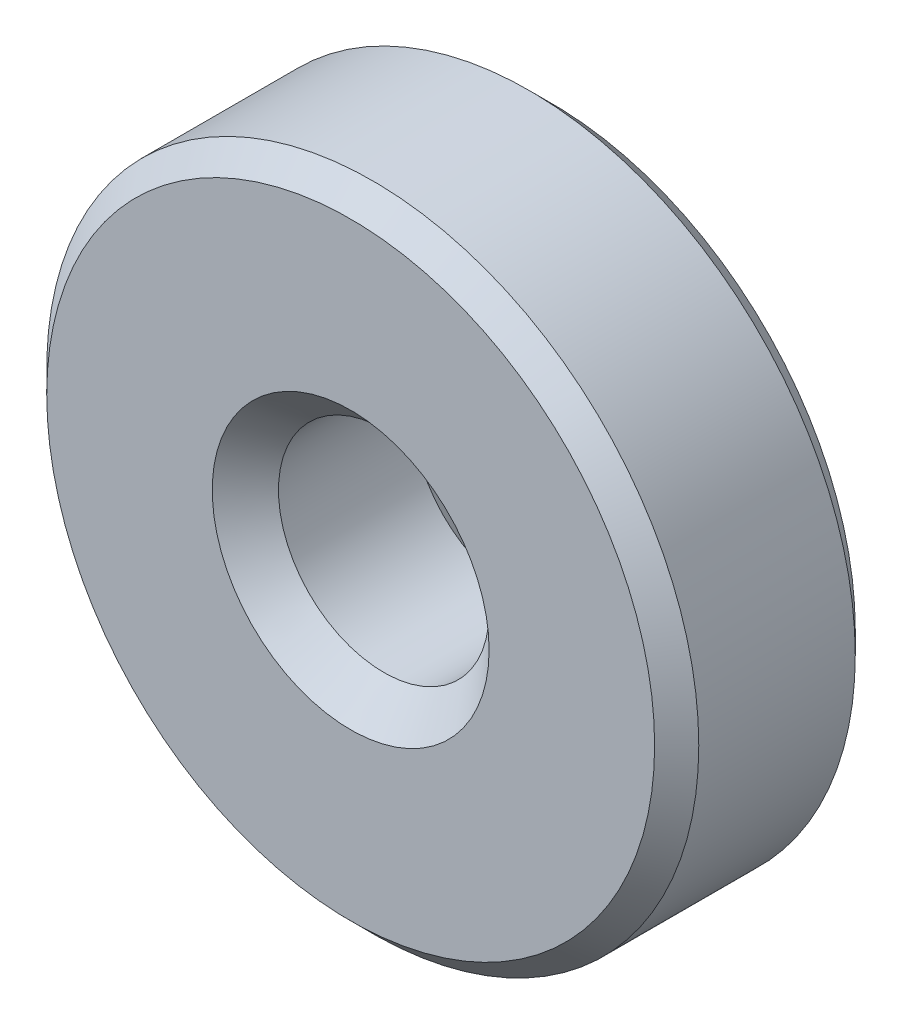
ISO-10303-21;
HEADER;
FILE_DESCRIPTION(('STEP AP214'),'2;1');
FILE_NAME('part.step','',(''),(''),'','','');
FILE_SCHEMA(('AUTOMOTIVE_DESIGN { 1 0 10303 214 1 1 1 1 }'));
ENDSEC;
DATA;
#1=APPLICATION_CONTEXT('core data for automotive mechanical design processes');
#2=APPLICATION_PROTOCOL_DEFINITION('international standard','automotive_design',2000,#1);
#3=PRODUCT_CONTEXT('',#1,'mechanical');
#4=PRODUCT('Part','Part','',(#3));
#5=PRODUCT_RELATED_PRODUCT_CATEGORY('part','',(#4));
#6=PRODUCT_DEFINITION_FORMATION('','',#4);
#7=PRODUCT_DEFINITION_CONTEXT('part definition',#1,'design');
#8=PRODUCT_DEFINITION('design','',#6,#7);
#9=PRODUCT_DEFINITION_SHAPE('','',#8);
#10=(LENGTH_UNIT() NAMED_UNIT(*) SI_UNIT(.MILLI.,.METRE.));
#11=(NAMED_UNIT(*) PLANE_ANGLE_UNIT() SI_UNIT($,.RADIAN.));
#12=(NAMED_UNIT(*) SI_UNIT($,.STERADIAN.) SOLID_ANGLE_UNIT());
#13=UNCERTAINTY_MEASURE_WITH_UNIT(LENGTH_MEASURE(1.E-05),#10,'distance_accuracy_value','');
#14=(GEOMETRIC_REPRESENTATION_CONTEXT(3) GLOBAL_UNCERTAINTY_ASSIGNED_CONTEXT((#13)) GLOBAL_UNIT_ASSIGNED_CONTEXT((#10,
#11,#12)) REPRESENTATION_CONTEXT('',''));
#15=CARTESIAN_POINT('',(0.,0.,0.));
#16=DIRECTION('',(0.,0.,1.));
#17=DIRECTION('',(1.,0.,0.));
#18=AXIS2_PLACEMENT_3D('',#15,#16,#17);
#19=CARTESIAN_POINT('',(0.,0.,-2.));
#20=DIRECTION('',(0.,0.,1.));
#21=DIRECTION('',(1.,0.,0.));
#22=AXIS2_PLACEMENT_3D('',#19,#20,#21);
#23=CYLINDRICAL_SURFACE('',#22,6.5);
#24=CARTESIAN_POINT('',(0.,0.,1.55999999999999));
#25=DIRECTION('',(0.,0.,1.));
#26=DIRECTION('',(1.,0.,0.));
#27=AXIS2_PLACEMENT_3D('',#24,#25,#26);
#28=CIRCLE('',#27,6.5);
#29=CARTESIAN_POINT('',(6.5,0.,1.55999999999999));
#30=VERTEX_POINT('',#29);
#31=EDGE_CURVE('E53',#30,#30,#28,.F.);
#32=ORIENTED_EDGE('',*,*,#31,.T.);
#33=EDGE_LOOP('',(#32));
#34=FACE_BOUND('',#33,.T.);
#35=CARTESIAN_POINT('',(0.,0.,-1.56));
#36=DIRECTION('',(0.,0.,1.));
#37=DIRECTION('',(1.,0.,0.));
#38=AXIS2_PLACEMENT_3D('',#35,#36,#37);
#39=CIRCLE('',#38,6.5);
#40=CARTESIAN_POINT('',(6.5,0.,-1.56));
#41=VERTEX_POINT('',#40);
#42=EDGE_CURVE('E56',#41,#41,#39,.T.);
#43=ORIENTED_EDGE('',*,*,#42,.T.);
#44=EDGE_LOOP('',(#43));
#45=FACE_BOUND('',#44,.T.);
#46=ADVANCED_FACE('F30',(#34,#45),#23,.T.);
#47=CARTESIAN_POINT('',(0.,0.,-2.));
#48=DIRECTION('',(0.,0.,1.));
#49=DIRECTION('',(1.,0.,0.));
#50=AXIS2_PLACEMENT_3D('',#47,#48,#49);
#51=PLANE('',#50);
#52=CARTESIAN_POINT('',(0.,0.,-2.));
#53=DIRECTION('',(0.,0.,1.));
#54=DIRECTION('',(1.,0.,0.));
#55=AXIS2_PLACEMENT_3D('',#52,#53,#54);
#56=CIRCLE('',#55,2.76);
#57=CARTESIAN_POINT('',(2.76,0.,-2.));
#58=VERTEX_POINT('',#57);
#59=EDGE_CURVE('E10',#58,#58,#56,.T.);
#60=ORIENTED_EDGE('',*,*,#59,.T.);
#61=EDGE_LOOP('',(#60));
#62=FACE_BOUND('',#61,.T.);
#63=CARTESIAN_POINT('',(0.,0.,-2.));
#64=DIRECTION('',(0.,0.,1.));
#65=DIRECTION('',(1.,0.,0.));
#66=AXIS2_PLACEMENT_3D('',#63,#64,#65);
#67=CIRCLE('',#66,6.05999999999999);
#68=CARTESIAN_POINT('',(6.05999999999999,0.,-2.));
#69=VERTEX_POINT('',#68);
#70=EDGE_CURVE('E50',#69,#69,#67,.F.);
#71=ORIENTED_EDGE('',*,*,#70,.T.);
#72=EDGE_LOOP('',(#71));
#73=FACE_BOUND('',#72,.T.);
#74=ADVANCED_FACE('F82',(#62,#73),#51,.F.);
#75=CARTESIAN_POINT('',(0.,0.,-2.));
#76=DIRECTION('',(0.,0.,1.));
#77=DIRECTION('',(1.,0.,0.));
#78=AXIS2_PLACEMENT_3D('',#75,#76,#77);
#79=CYLINDRICAL_SURFACE('',#78,2.1);
#80=CARTESIAN_POINT('',(0.,0.,1.34));
#81=DIRECTION('',(0.,0.,1.));
#82=DIRECTION('',(1.,0.,0.));
#83=AXIS2_PLACEMENT_3D('',#80,#81,#82);
#84=CIRCLE('',#83,2.1);
#85=CARTESIAN_POINT('',(2.1,0.,1.34));
#86=VERTEX_POINT('',#85);
#87=EDGE_CURVE('E41',#86,#86,#84,.T.);
#88=ORIENTED_EDGE('',*,*,#87,.T.);
#89=EDGE_LOOP('',(#88));
#90=FACE_BOUND('',#89,.T.);
#91=CARTESIAN_POINT('',(0.,0.,-1.34));
#92=DIRECTION('',(0.,0.,1.));
#93=DIRECTION('',(1.,0.,0.));
#94=AXIS2_PLACEMENT_3D('',#91,#92,#93);
#95=CIRCLE('',#94,2.1);
#96=CARTESIAN_POINT('',(2.1,0.,-1.34));
#97=VERTEX_POINT('',#96);
#98=EDGE_CURVE('E45',#97,#97,#95,.F.);
#99=ORIENTED_EDGE('',*,*,#98,.T.);
#100=EDGE_LOOP('',(#99));
#101=FACE_BOUND('',#100,.T.);
#102=ADVANCED_FACE('F77',(#90,#101),#79,.F.);
#103=CARTESIAN_POINT('',(0.,0.,2.));
#104=DIRECTION('',(0.,0.,1.));
#105=DIRECTION('',(1.,0.,0.));
#106=AXIS2_PLACEMENT_3D('',#103,#104,#105);
#107=PLANE('',#106);
#108=CARTESIAN_POINT('',(0.,0.,2.));
#109=DIRECTION('',(0.,0.,1.));
#110=DIRECTION('',(1.,0.,0.));
#111=AXIS2_PLACEMENT_3D('',#108,#109,#110);
#112=CIRCLE('',#111,2.76);
#113=CARTESIAN_POINT('',(2.76,0.,2.));
#114=VERTEX_POINT('',#113);
#115=EDGE_CURVE('E37',#114,#114,#112,.F.);
#116=ORIENTED_EDGE('',*,*,#115,.T.);
#117=EDGE_LOOP('',(#116));
#118=FACE_BOUND('',#117,.T.);
#119=CARTESIAN_POINT('',(0.,0.,2.));
#120=DIRECTION('',(0.,0.,1.));
#121=DIRECTION('',(1.,0.,0.));
#122=AXIS2_PLACEMENT_3D('',#119,#120,#121);
#123=CIRCLE('',#122,6.06);
#124=CARTESIAN_POINT('',(6.06,0.,2.));
#125=VERTEX_POINT('',#124);
#126=EDGE_CURVE('E59',#125,#125,#123,.T.);
#127=ORIENTED_EDGE('',*,*,#126,.T.);
#128=EDGE_LOOP('',(#127));
#129=FACE_BOUND('',#128,.T.);
#130=ADVANCED_FACE('F63',(#118,#129),#107,.T.);
#131=CARTESIAN_POINT('',(0.,0.,2.));
#132=DIRECTION('',(0.,0.,-1.));
#133=DIRECTION('',(-1.,0.,0.));
#134=AXIS2_PLACEMENT_3D('',#131,#132,#133);
#135=CONICAL_SURFACE('',#134,6.06,0.785398163397445);
#136=ORIENTED_EDGE('',*,*,#31,.F.);
#137=EDGE_LOOP('',(#136));
#138=FACE_BOUND('',#137,.T.);
#139=ORIENTED_EDGE('',*,*,#126,.F.);
#140=EDGE_LOOP('',(#139));
#141=FACE_BOUND('',#140,.T.);
#142=ADVANCED_FACE('F65',(#138,#141),#135,.T.);
#143=CARTESIAN_POINT('',(0.,0.,-1.56));
#144=DIRECTION('',(0.,0.,1.));
#145=DIRECTION('',(1.,0.,0.));
#146=AXIS2_PLACEMENT_3D('',#143,#144,#145);
#147=CONICAL_SURFACE('',#146,6.5,0.785398163397453);
#148=CARTESIAN_POINT('',(6.05999999999999,0.,-2.));
#149=CARTESIAN_POINT('',(6.06458333333333,0.,-1.99541666666667));
#150=CARTESIAN_POINT('',(6.06916666666666,0.,-1.99083333333333));
#151=CARTESIAN_POINT('',(6.07833333333333,0.,-1.98166666666667));
#152=CARTESIAN_POINT('',(6.08291666666666,0.,-1.97708333333333));
#153=CARTESIAN_POINT('',(6.09208333333333,0.,-1.96791666666667));
#154=CARTESIAN_POINT('',(6.09666666666666,0.,-1.96333333333333));
#155=CARTESIAN_POINT('',(6.10583333333333,0.,-1.95416666666667));
#156=CARTESIAN_POINT('',(6.11041666666666,0.,-1.94958333333333));
#157=CARTESIAN_POINT('',(6.11958333333333,0.,-1.94041666666667));
#158=CARTESIAN_POINT('',(6.12416666666666,0.,-1.93583333333333));
#159=CARTESIAN_POINT('',(6.13333333333333,0.,-1.92666666666667));
#160=CARTESIAN_POINT('',(6.13791666666666,0.,-1.92208333333333));
#161=CARTESIAN_POINT('',(6.14708333333333,0.,-1.91291666666667));
#162=CARTESIAN_POINT('',(6.15166666666666,0.,-1.90833333333333));
#163=CARTESIAN_POINT('',(6.16083333333333,0.,-1.89916666666667));
#164=CARTESIAN_POINT('',(6.16541666666666,0.,-1.89458333333333));
#165=CARTESIAN_POINT('',(6.17458333333333,0.,-1.88541666666667));
#166=CARTESIAN_POINT('',(6.17916666666666,0.,-1.88083333333333));
#167=CARTESIAN_POINT('',(6.18833333333333,0.,-1.87166666666667));
#168=CARTESIAN_POINT('',(6.19291666666666,0.,-1.86708333333333));
#169=CARTESIAN_POINT('',(6.20208333333333,0.,-1.85791666666667));
#170=CARTESIAN_POINT('',(6.20666666666666,0.,-1.85333333333333));
#171=CARTESIAN_POINT('',(6.21583333333333,0.,-1.84416666666667));
#172=CARTESIAN_POINT('',(6.22041666666666,0.,-1.83958333333333));
#173=CARTESIAN_POINT('',(6.22958333333333,0.,-1.83041666666667));
#174=CARTESIAN_POINT('',(6.23416666666666,0.,-1.82583333333333));
#175=CARTESIAN_POINT('',(6.24333333333333,0.,-1.81666666666667));
#176=CARTESIAN_POINT('',(6.24791666666666,0.,-1.81208333333333));
#177=CARTESIAN_POINT('',(6.25708333333333,0.,-1.80291666666667));
#178=CARTESIAN_POINT('',(6.26166666666666,0.,-1.79833333333333));
#179=CARTESIAN_POINT('',(6.27083333333333,0.,-1.78916666666667));
#180=CARTESIAN_POINT('',(6.27541666666666,0.,-1.78458333333333));
#181=CARTESIAN_POINT('',(6.28458333333333,0.,-1.77541666666667));
#182=CARTESIAN_POINT('',(6.28916666666666,0.,-1.77083333333333));
#183=CARTESIAN_POINT('',(6.29833333333333,0.,-1.76166666666667));
#184=CARTESIAN_POINT('',(6.30291666666666,0.,-1.75708333333333));
#185=CARTESIAN_POINT('',(6.31208333333333,0.,-1.74791666666667));
#186=CARTESIAN_POINT('',(6.31666666666666,0.,-1.74333333333333));
#187=CARTESIAN_POINT('',(6.32583333333333,0.,-1.73416666666667));
#188=CARTESIAN_POINT('',(6.33041666666666,0.,-1.72958333333333));
#189=CARTESIAN_POINT('',(6.33958333333333,0.,-1.72041666666667));
#190=CARTESIAN_POINT('',(6.34416666666666,0.,-1.71583333333333));
#191=CARTESIAN_POINT('',(6.35333333333333,0.,-1.70666666666667));
#192=CARTESIAN_POINT('',(6.35791666666667,0.,-1.70208333333333));
#193=CARTESIAN_POINT('',(6.36708333333333,0.,-1.69291666666667));
#194=CARTESIAN_POINT('',(6.37166666666667,0.,-1.68833333333333));
#195=CARTESIAN_POINT('',(6.38083333333333,0.,-1.67916666666667));
#196=CARTESIAN_POINT('',(6.38541666666667,0.,-1.67458333333333));
#197=CARTESIAN_POINT('',(6.39458333333333,0.,-1.66541666666667));
#198=CARTESIAN_POINT('',(6.39916666666667,0.,-1.66083333333333));
#199=CARTESIAN_POINT('',(6.40833333333333,0.,-1.65166666666667));
#200=CARTESIAN_POINT('',(6.41291666666667,0.,-1.64708333333333));
#201=CARTESIAN_POINT('',(6.42208333333333,0.,-1.63791666666667));
#202=CARTESIAN_POINT('',(6.42666666666667,0.,-1.63333333333333));
#203=CARTESIAN_POINT('',(6.43583333333333,0.,-1.62416666666666));
#204=CARTESIAN_POINT('',(6.44041666666667,0.,-1.61958333333333));
#205=CARTESIAN_POINT('',(6.44958333333333,0.,-1.61041666666667));
#206=CARTESIAN_POINT('',(6.45416666666667,0.,-1.60583333333333));
#207=CARTESIAN_POINT('',(6.46333333333333,0.,-1.59666666666667));
#208=CARTESIAN_POINT('',(6.46791666666667,0.,-1.59208333333333));
#209=CARTESIAN_POINT('',(6.47708333333333,0.,-1.58291666666666));
#210=CARTESIAN_POINT('',(6.48166666666667,0.,-1.57833333333333));
#211=CARTESIAN_POINT('',(6.49083333333333,0.,-1.56916666666666));
#212=CARTESIAN_POINT('',(6.49541666666667,0.,-1.56458333333333));
#213=CARTESIAN_POINT('',(6.5,0.,-1.56));
#214=B_SPLINE_CURVE_WITH_KNOTS('',3,(#148,#149,#150,#151,#152,#153,#154,#155,#156,#157,#158,
#159,#160,#161,#162,#163,#164,#165,#166,#167,#168,#169,#170,#171,#172,#173,#174,#175,#176,#177,
#178,#179,#180,#181,#182,#183,#184,#185,#186,#187,#188,#189,#190,#191,#192,#193,#194,#195,#196,
#197,#198,#199,#200,#201,#202,#203,#204,#205,#206,#207,#208,#209,#210,#211,#212,#213),
.UNSPECIFIED.,.F.,.F.,(4,2,2,2,2,2,2,2,2,2,2,2,2,2,2,2,2,2,2,2,2,2,2,2,2,2,2,2,2,2,2,2,4),(0.,
0.0194454364826302,0.0388908729652601,0.0583363094478909,0.0777817459305207,0.0972271824131514,
0.116672618895781,0.136118055378411,0.155563491861042,0.175008928343672,0.194454364826302,
0.213899801308933,0.233345237791563,0.252790674274193,0.272236110756824,0.291681547239453,
0.311126983722084,0.330572420204714,0.350017856687344,0.369463293169975,0.388908729652605,
0.408354166135235,0.427799602617865,0.447245039100495,0.466690475583126,0.486135912065756,
0.505581348548387,0.525026785031017,0.544472221513647,0.563917657996277,0.583363094478907,
0.602808530961538,0.622253967444168),.UNSPECIFIED.);
#215=EDGE_CURVE('BSEAM67',#69,#41,#214,.T.);
#216=ORIENTED_EDGE('',*,*,#70,.F.);
#217=ORIENTED_EDGE('',*,*,#42,.F.);
#218=ORIENTED_EDGE('',*,*,#215,.T.);
#219=ORIENTED_EDGE('',*,*,#215,.F.);
#220=EDGE_LOOP('',(#216,#218,#217,#219));
#221=FACE_BOUND('',#220,.T.);
#222=ADVANCED_FACE('F67',(#221),#147,.T.);
#223=CARTESIAN_POINT('',(0.,0.,1.34));
#224=DIRECTION('',(0.,0.,1.));
#225=DIRECTION('',(1.,0.,0.));
#226=AXIS2_PLACEMENT_3D('',#223,#224,#225);
#227=CONICAL_SURFACE('',#226,2.1,0.785398163397448);
#228=ORIENTED_EDGE('',*,*,#115,.F.);
#229=EDGE_LOOP('',(#228));
#230=FACE_BOUND('',#229,.T.);
#231=ORIENTED_EDGE('',*,*,#87,.F.);
#232=EDGE_LOOP('',(#231));
#233=FACE_BOUND('',#232,.T.);
#234=ADVANCED_FACE('F74',(#230,#233),#227,.F.);
#235=CARTESIAN_POINT('',(0.,0.,-2.));
#236=DIRECTION('',(0.,0.,-1.));
#237=DIRECTION('',(-1.,0.,0.));
#238=AXIS2_PLACEMENT_3D('',#235,#236,#237);
#239=CONICAL_SURFACE('',#238,2.76,0.785398163397445);
#240=ORIENTED_EDGE('',*,*,#98,.F.);
#241=EDGE_LOOP('',(#240));
#242=FACE_BOUND('',#241,.T.);
#243=ORIENTED_EDGE('',*,*,#59,.F.);
#244=EDGE_LOOP('',(#243));
#245=FACE_BOUND('',#244,.T.);
#246=ADVANCED_FACE('F32',(#242,#245),#239,.F.);
#247=CLOSED_SHELL('',(#46,#74,#102,#130,#142,#222,#234,#246));
#248=MANIFOLD_SOLID_BREP('B2',#247);
#249=ADVANCED_BREP_SHAPE_REPRESENTATION('',(#18,#248),#14);
#250=SHAPE_DEFINITION_REPRESENTATION(#9,#249);
ENDSEC;
END-ISO-10303-21;
